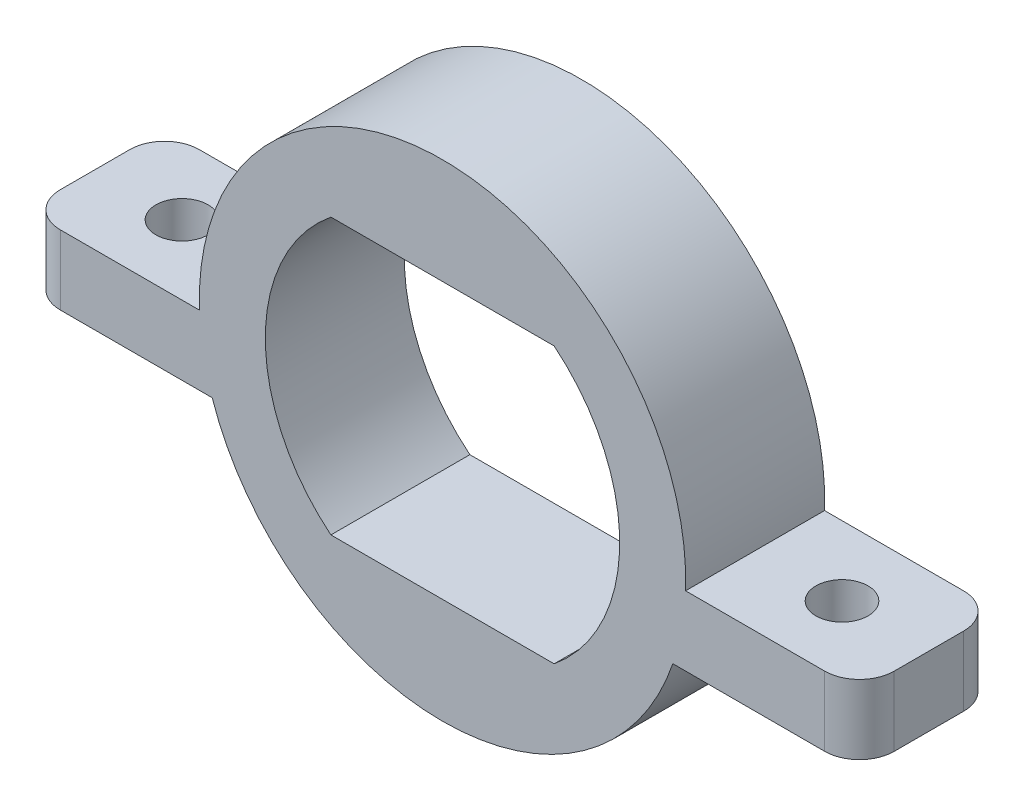
ISO-10303-21;
HEADER;
FILE_DESCRIPTION(('STEP AP214'),'2;1');
FILE_NAME('part.step','',(''),(''),'','','');
FILE_SCHEMA(('AUTOMOTIVE_DESIGN { 1 0 10303 214 1 1 1 1 }'));
ENDSEC;
DATA;
#1=APPLICATION_CONTEXT('core data for automotive mechanical design processes');
#2=APPLICATION_PROTOCOL_DEFINITION('international standard','automotive_design',2000,#1);
#3=PRODUCT_CONTEXT('',#1,'mechanical');
#4=PRODUCT('Part','Part','',(#3));
#5=PRODUCT_RELATED_PRODUCT_CATEGORY('part','',(#4));
#6=PRODUCT_DEFINITION_FORMATION('','',#4);
#7=PRODUCT_DEFINITION_CONTEXT('part definition',#1,'design');
#8=PRODUCT_DEFINITION('design','',#6,#7);
#9=PRODUCT_DEFINITION_SHAPE('','',#8);
#10=(LENGTH_UNIT() NAMED_UNIT(*) SI_UNIT(.MILLI.,.METRE.));
#11=(NAMED_UNIT(*) PLANE_ANGLE_UNIT() SI_UNIT($,.RADIAN.));
#12=(NAMED_UNIT(*) SI_UNIT($,.STERADIAN.) SOLID_ANGLE_UNIT());
#13=UNCERTAINTY_MEASURE_WITH_UNIT(LENGTH_MEASURE(1.E-05),#10,'distance_accuracy_value','');
#14=(GEOMETRIC_REPRESENTATION_CONTEXT(3) GLOBAL_UNCERTAINTY_ASSIGNED_CONTEXT((#13)) GLOBAL_UNIT_ASSIGNED_CONTEXT((#10,
#11,#12)) REPRESENTATION_CONTEXT('',''));
#15=CARTESIAN_POINT('',(0.,0.,0.));
#16=DIRECTION('',(0.,0.,1.));
#17=DIRECTION('',(1.,0.,0.));
#18=AXIS2_PLACEMENT_3D('',#15,#16,#17);
#19=CARTESIAN_POINT('',(24.,-0.5,8.));
#20=DIRECTION('',(0.,-1.,0.));
#21=DIRECTION('',(0.,0.,-1.));
#22=AXIS2_PLACEMENT_3D('',#19,#20,#21);
#23=PLANE('',#22);
#24=CARTESIAN_POINT('',(18.9955342898166,-0.5,4.));
#25=DIRECTION('',(0.,1.,0.));
#26=DIRECTION('',(0.,0.,1.));
#27=AXIS2_PLACEMENT_3D('',#24,#25,#26);
#28=CIRCLE('',#27,1.5);
#29=CARTESIAN_POINT('',(18.9955342898166,-0.5,5.5));
#30=VERTEX_POINT('',#29);
#31=EDGE_CURVE('E177',#30,#30,#28,.T.);
#32=ORIENTED_EDGE('',*,*,#31,.F.);
#33=EDGE_LOOP('',(#32));
#34=FACE_BOUND('',#33,.T.);
#35=DIRECTION('',(-1.,0.,0.));
#36=VECTOR('',#35,1.);
#37=CARTESIAN_POINT('',(24.,-0.5,8.));
#38=LINE('',#37,#36);
#39=CARTESIAN_POINT('',(22.,-0.5,8.));
#40=VERTEX_POINT('',#39);
#41=CARTESIAN_POINT('',(13.9910685796332,-0.500000000000002,8.));
#42=VERTEX_POINT('',#41);
#43=EDGE_CURVE('E194',#40,#42,#38,.T.);
#44=ORIENTED_EDGE('',*,*,#43,.F.);
#45=CARTESIAN_POINT('',(22.,-0.5,6.));
#46=DIRECTION('',(0.,-1.,0.));
#47=DIRECTION('',(0.,0.,-1.));
#48=AXIS2_PLACEMENT_3D('',#45,#46,#47);
#49=CIRCLE('',#48,2.);
#50=CARTESIAN_POINT('',(24.,-0.5,6.));
#51=VERTEX_POINT('',#50);
#52=EDGE_CURVE('E266',#40,#51,#49,.F.);
#53=ORIENTED_EDGE('',*,*,#52,.T.);
#54=DIRECTION('',(0.,0.,-1.));
#55=VECTOR('',#54,1.);
#56=CARTESIAN_POINT('',(24.,-0.5,8.));
#57=LINE('',#56,#55);
#58=CARTESIAN_POINT('',(24.,-0.5,2.));
#59=VERTEX_POINT('',#58);
#60=EDGE_CURVE('E209',#51,#59,#57,.T.);
#61=ORIENTED_EDGE('',*,*,#60,.T.);
#62=CARTESIAN_POINT('',(22.,-0.5,2.));
#63=DIRECTION('',(0.,-1.,0.));
#64=DIRECTION('',(0.,0.,-1.));
#65=AXIS2_PLACEMENT_3D('',#62,#63,#64);
#66=CIRCLE('',#65,2.);
#67=CARTESIAN_POINT('',(22.,-0.5,0.));
#68=VERTEX_POINT('',#67);
#69=EDGE_CURVE('E264',#59,#68,#66,.F.);
#70=ORIENTED_EDGE('',*,*,#69,.T.);
#71=DIRECTION('',(-1.,0.,0.));
#72=VECTOR('',#71,1.);
#73=CARTESIAN_POINT('',(24.,-0.5,0.));
#74=LINE('',#73,#72);
#75=CARTESIAN_POINT('',(13.9910685796332,-0.500000000000002,0.));
#76=VERTEX_POINT('',#75);
#77=EDGE_CURVE('E190',#68,#76,#74,.T.);
#78=ORIENTED_EDGE('',*,*,#77,.T.);
#79=DIRECTION('',(0.,0.,-1.));
#80=VECTOR('',#79,1.);
#81=CARTESIAN_POINT('',(13.9910685796332,-0.500000000000002,8.));
#82=LINE('',#81,#80);
#83=EDGE_CURVE('E241',#42,#76,#82,.T.);
#84=ORIENTED_EDGE('',*,*,#83,.F.);
#85=EDGE_LOOP('',(#44,#53,#61,#70,#78,#84));
#86=FACE_BOUND('',#85,.T.);
#87=ADVANCED_FACE('F33',(#34,#86),#23,.F.);
#88=CARTESIAN_POINT('',(0.,0.,8.));
#89=DIRECTION('',(0.,0.,-1.));
#90=DIRECTION('',(-1.,0.,0.));
#91=AXIS2_PLACEMENT_3D('',#88,#89,#90);
#92=CYLINDRICAL_SURFACE('',#91,14.);
#93=CARTESIAN_POINT('',(0.,0.,0.));
#94=DIRECTION('',(0.,0.,1.));
#95=DIRECTION('',(1.,0.,0.));
#96=AXIS2_PLACEMENT_3D('',#93,#94,#95);
#97=CIRCLE('',#96,14.);
#98=CARTESIAN_POINT('',(-13.9910685796332,-0.499999999999997,0.));
#99=VERTEX_POINT('',#98);
#100=EDGE_CURVE('E211',#76,#99,#97,.T.);
#101=ORIENTED_EDGE('',*,*,#100,.T.);
#102=DIRECTION('',(0.,0.,-1.));
#103=VECTOR('',#102,1.);
#104=CARTESIAN_POINT('',(-13.9910685796332,-0.499999999999997,8.));
#105=LINE('',#104,#103);
#106=CARTESIAN_POINT('',(-13.9910685796332,-0.499999999999997,8.));
#107=VERTEX_POINT('',#106);
#108=EDGE_CURVE('E238',#107,#99,#105,.T.);
#109=ORIENTED_EDGE('',*,*,#108,.F.);
#110=CARTESIAN_POINT('',(0.,0.,8.));
#111=DIRECTION('',(0.,0.,1.));
#112=DIRECTION('',(1.,0.,0.));
#113=AXIS2_PLACEMENT_3D('',#110,#111,#112);
#114=CIRCLE('',#113,14.);
#115=EDGE_CURVE('E196',#42,#107,#114,.T.);
#116=ORIENTED_EDGE('',*,*,#115,.F.);
#117=ORIENTED_EDGE('',*,*,#83,.T.);
#118=EDGE_LOOP('',(#101,#109,#116,#117));
#119=FACE_BOUND('',#118,.T.);
#120=ADVANCED_FACE('F327',(#119),#92,.T.);
#121=CARTESIAN_POINT('',(-24.,-0.5,8.));
#122=DIRECTION('',(0.,1.,0.));
#123=DIRECTION('',(0.,0.,1.));
#124=AXIS2_PLACEMENT_3D('',#121,#122,#123);
#125=PLANE('',#124);
#126=CARTESIAN_POINT('',(-18.9955342898166,-0.5,4.));
#127=DIRECTION('',(0.,1.,0.));
#128=DIRECTION('',(0.,0.,1.));
#129=AXIS2_PLACEMENT_3D('',#126,#127,#128);
#130=CIRCLE('',#129,1.5);
#131=CARTESIAN_POINT('',(-18.9955342898166,-0.5,5.5));
#132=VERTEX_POINT('',#131);
#133=EDGE_CURVE('E250',#132,#132,#130,.T.);
#134=ORIENTED_EDGE('',*,*,#133,.F.);
#135=EDGE_LOOP('',(#134));
#136=FACE_BOUND('',#135,.T.);
#137=DIRECTION('',(1.,0.,0.));
#138=VECTOR('',#137,1.);
#139=CARTESIAN_POINT('',(-24.,-0.5,0.));
#140=LINE('',#139,#138);
#141=CARTESIAN_POINT('',(-22.,-0.5,0.));
#142=VERTEX_POINT('',#141);
#143=EDGE_CURVE('E214',#142,#99,#140,.T.);
#144=ORIENTED_EDGE('',*,*,#143,.F.);
#145=CARTESIAN_POINT('',(-22.,-0.5,2.));
#146=DIRECTION('',(0.,1.,0.));
#147=DIRECTION('',(0.,0.,1.));
#148=AXIS2_PLACEMENT_3D('',#145,#146,#147);
#149=CIRCLE('',#148,2.);
#150=CARTESIAN_POINT('',(-24.,-0.5,2.));
#151=VERTEX_POINT('',#150);
#152=EDGE_CURVE('E11',#142,#151,#149,.T.);
#153=ORIENTED_EDGE('',*,*,#152,.T.);
#154=DIRECTION('',(0.,0.,-1.));
#155=VECTOR('',#154,1.);
#156=CARTESIAN_POINT('',(-24.,-0.5,8.));
#157=LINE('',#156,#155);
#158=CARTESIAN_POINT('',(-24.,-0.5,6.));
#159=VERTEX_POINT('',#158);
#160=EDGE_CURVE('E236',#159,#151,#157,.T.);
#161=ORIENTED_EDGE('',*,*,#160,.F.);
#162=CARTESIAN_POINT('',(-22.,-0.5,6.));
#163=DIRECTION('',(0.,1.,0.));
#164=DIRECTION('',(0.,0.,1.));
#165=AXIS2_PLACEMENT_3D('',#162,#163,#164);
#166=CIRCLE('',#165,2.);
#167=CARTESIAN_POINT('',(-22.,-0.5,8.));
#168=VERTEX_POINT('',#167);
#169=EDGE_CURVE('E41',#159,#168,#166,.T.);
#170=ORIENTED_EDGE('',*,*,#169,.T.);
#171=DIRECTION('',(1.,0.,0.));
#172=VECTOR('',#171,1.);
#173=CARTESIAN_POINT('',(-24.,-0.5,8.));
#174=LINE('',#173,#172);
#175=EDGE_CURVE('E200',#168,#107,#174,.T.);
#176=ORIENTED_EDGE('',*,*,#175,.T.);
#177=ORIENTED_EDGE('',*,*,#108,.T.);
#178=EDGE_LOOP('',(#144,#153,#161,#170,#176,#177));
#179=FACE_BOUND('',#178,.T.);
#180=ADVANCED_FACE('F282',(#136,#179),#125,.T.);
#181=CARTESIAN_POINT('',(-24.,-0.5,8.));
#182=DIRECTION('',(1.,0.,0.));
#183=DIRECTION('',(0.,0.,-1.));
#184=AXIS2_PLACEMENT_3D('',#181,#182,#183);
#185=PLANE('',#184);
#186=ORIENTED_EDGE('',*,*,#160,.T.);
#187=DIRECTION('',(0.,-1.,0.));
#188=VECTOR('',#187,1.);
#189=CARTESIAN_POINT('',(-24.,-0.5,2.));
#190=LINE('',#189,#188);
#191=CARTESIAN_POINT('',(-24.,-4.5,2.));
#192=VERTEX_POINT('',#191);
#193=EDGE_CURVE('E274',#151,#192,#190,.T.);
#194=ORIENTED_EDGE('',*,*,#193,.T.);
#195=DIRECTION('',(0.,0.,-1.));
#196=VECTOR('',#195,1.);
#197=CARTESIAN_POINT('',(-24.,-4.5,8.));
#198=LINE('',#197,#196);
#199=CARTESIAN_POINT('',(-24.,-4.5,6.));
#200=VERTEX_POINT('',#199);
#201=EDGE_CURVE('E233',#200,#192,#198,.T.);
#202=ORIENTED_EDGE('',*,*,#201,.F.);
#203=DIRECTION('',(0.,-1.,0.));
#204=VECTOR('',#203,1.);
#205=CARTESIAN_POINT('',(-24.,-0.5,6.));
#206=LINE('',#205,#204);
#207=EDGE_CURVE('E53',#200,#159,#206,.F.);
#208=ORIENTED_EDGE('',*,*,#207,.T.);
#209=EDGE_LOOP('',(#186,#194,#202,#208));
#210=FACE_BOUND('',#209,.T.);
#211=ADVANCED_FACE('F294',(#210),#185,.F.);
#212=CARTESIAN_POINT('',(-24.,-4.5,8.));
#213=DIRECTION('',(0.,1.,0.));
#214=DIRECTION('',(0.,0.,1.));
#215=AXIS2_PLACEMENT_3D('',#212,#213,#214);
#216=PLANE('',#215);
#217=CARTESIAN_POINT('',(-18.9955342898166,-4.5,4.));
#218=DIRECTION('',(0.,1.,0.));
#219=DIRECTION('',(0.,0.,1.));
#220=AXIS2_PLACEMENT_3D('',#217,#218,#219);
#221=CIRCLE('',#220,1.5);
#222=CARTESIAN_POINT('',(-18.9955342898166,-4.5,5.5));
#223=VERTEX_POINT('',#222);
#224=EDGE_CURVE('E247',#223,#223,#221,.T.);
#225=ORIENTED_EDGE('',*,*,#224,.T.);
#226=EDGE_LOOP('',(#225));
#227=FACE_BOUND('',#226,.T.);
#228=ORIENTED_EDGE('',*,*,#201,.T.);
#229=CARTESIAN_POINT('',(-22.,-4.5,2.));
#230=DIRECTION('',(0.,1.,0.));
#231=DIRECTION('',(0.,0.,1.));
#232=AXIS2_PLACEMENT_3D('',#229,#230,#231);
#233=CIRCLE('',#232,2.);
#234=CARTESIAN_POINT('',(-22.,-4.5,0.));
#235=VERTEX_POINT('',#234);
#236=EDGE_CURVE('E279',#192,#235,#233,.F.);
#237=ORIENTED_EDGE('',*,*,#236,.T.);
#238=DIRECTION('',(1.,0.,0.));
#239=VECTOR('',#238,1.);
#240=CARTESIAN_POINT('',(-24.,-4.5,0.));
#241=LINE('',#240,#239);
#242=CARTESIAN_POINT('',(-13.2570735835629,-4.5,0.));
#243=VERTEX_POINT('',#242);
#244=EDGE_CURVE('E216',#235,#243,#241,.T.);
#245=ORIENTED_EDGE('',*,*,#244,.T.);
#246=DIRECTION('',(0.,0.,-1.));
#247=VECTOR('',#246,1.);
#248=CARTESIAN_POINT('',(-13.2570735835629,-4.5,8.));
#249=LINE('',#248,#247);
#250=CARTESIAN_POINT('',(-13.2570735835629,-4.5,8.));
#251=VERTEX_POINT('',#250);
#252=EDGE_CURVE('E230',#251,#243,#249,.T.);
#253=ORIENTED_EDGE('',*,*,#252,.F.);
#254=DIRECTION('',(1.,0.,0.));
#255=VECTOR('',#254,1.);
#256=CARTESIAN_POINT('',(-24.,-4.5,8.));
#257=LINE('',#256,#255);
#258=CARTESIAN_POINT('',(-22.,-4.5,8.));
#259=VERTEX_POINT('',#258);
#260=EDGE_CURVE('E202',#259,#251,#257,.T.);
#261=ORIENTED_EDGE('',*,*,#260,.F.);
#262=CARTESIAN_POINT('',(-22.,-4.5,6.));
#263=DIRECTION('',(0.,1.,0.));
#264=DIRECTION('',(0.,0.,1.));
#265=AXIS2_PLACEMENT_3D('',#262,#263,#264);
#266=CIRCLE('',#265,2.);
#267=EDGE_CURVE('E277',#259,#200,#266,.F.);
#268=ORIENTED_EDGE('',*,*,#267,.T.);
#269=EDGE_LOOP('',(#228,#237,#245,#253,#261,#268));
#270=FACE_BOUND('',#269,.T.);
#271=ADVANCED_FACE('F292',(#227,#270),#216,.F.);
#272=CARTESIAN_POINT('',(0.,0.,8.));
#273=DIRECTION('',(0.,0.,-1.));
#274=DIRECTION('',(-1.,0.,0.));
#275=AXIS2_PLACEMENT_3D('',#272,#273,#274);
#276=CYLINDRICAL_SURFACE('',#275,14.);
#277=CARTESIAN_POINT('',(0.,0.,0.));
#278=DIRECTION('',(0.,0.,1.));
#279=DIRECTION('',(1.,0.,0.));
#280=AXIS2_PLACEMENT_3D('',#277,#278,#279);
#281=CIRCLE('',#280,14.);
#282=CARTESIAN_POINT('',(13.2570735835628,-4.50000000000001,0.));
#283=VERTEX_POINT('',#282);
#284=EDGE_CURVE('E218',#243,#283,#281,.T.);
#285=ORIENTED_EDGE('',*,*,#284,.T.);
#286=DIRECTION('',(0.,0.,-1.));
#287=VECTOR('',#286,1.);
#288=CARTESIAN_POINT('',(13.2570735835628,-4.50000000000001,8.));
#289=LINE('',#288,#287);
#290=CARTESIAN_POINT('',(13.2570735835628,-4.50000000000001,8.));
#291=VERTEX_POINT('',#290);
#292=EDGE_CURVE('E227',#291,#283,#289,.T.);
#293=ORIENTED_EDGE('',*,*,#292,.F.);
#294=CARTESIAN_POINT('',(0.,0.,8.));
#295=DIRECTION('',(0.,0.,1.));
#296=DIRECTION('',(1.,0.,0.));
#297=AXIS2_PLACEMENT_3D('',#294,#295,#296);
#298=CIRCLE('',#297,14.);
#299=EDGE_CURVE('E204',#251,#291,#298,.T.);
#300=ORIENTED_EDGE('',*,*,#299,.F.);
#301=ORIENTED_EDGE('',*,*,#252,.T.);
#302=EDGE_LOOP('',(#285,#293,#300,#301));
#303=FACE_BOUND('',#302,.T.);
#304=ADVANCED_FACE('F305',(#303),#276,.T.);
#305=CARTESIAN_POINT('',(24.,-4.5,8.));
#306=DIRECTION('',(0.,-1.,0.));
#307=DIRECTION('',(0.,0.,-1.));
#308=AXIS2_PLACEMENT_3D('',#305,#306,#307);
#309=PLANE('',#308);
#310=CARTESIAN_POINT('',(18.9955342898166,-4.5,4.));
#311=DIRECTION('',(0.,-1.,0.));
#312=DIRECTION('',(0.,0.,-1.));
#313=AXIS2_PLACEMENT_3D('',#310,#311,#312);
#314=CIRCLE('',#313,1.5);
#315=CARTESIAN_POINT('',(18.9955342898166,-4.5,2.5));
#316=VERTEX_POINT('',#315);
#317=EDGE_CURVE('E184',#316,#316,#314,.T.);
#318=ORIENTED_EDGE('',*,*,#317,.F.);
#319=EDGE_LOOP('',(#318));
#320=FACE_BOUND('',#319,.T.);
#321=DIRECTION('',(0.,0.,-1.));
#322=VECTOR('',#321,1.);
#323=CARTESIAN_POINT('',(24.,-4.5,8.));
#324=LINE('',#323,#322);
#325=CARTESIAN_POINT('',(24.,-4.5,6.));
#326=VERTEX_POINT('',#325);
#327=CARTESIAN_POINT('',(24.,-4.5,2.));
#328=VERTEX_POINT('',#327);
#329=EDGE_CURVE('E224',#326,#328,#324,.T.);
#330=ORIENTED_EDGE('',*,*,#329,.F.);
#331=CARTESIAN_POINT('',(22.,-4.5,6.));
#332=DIRECTION('',(0.,-1.,0.));
#333=DIRECTION('',(0.,0.,-1.));
#334=AXIS2_PLACEMENT_3D('',#331,#332,#333);
#335=CIRCLE('',#334,2.);
#336=CARTESIAN_POINT('',(22.,-4.5,8.));
#337=VERTEX_POINT('',#336);
#338=EDGE_CURVE('E257',#326,#337,#335,.T.);
#339=ORIENTED_EDGE('',*,*,#338,.T.);
#340=DIRECTION('',(-1.,0.,0.));
#341=VECTOR('',#340,1.);
#342=CARTESIAN_POINT('',(24.,-4.5,8.));
#343=LINE('',#342,#341);
#344=EDGE_CURVE('E207',#337,#291,#343,.T.);
#345=ORIENTED_EDGE('',*,*,#344,.T.);
#346=ORIENTED_EDGE('',*,*,#292,.T.);
#347=DIRECTION('',(-1.,0.,0.));
#348=VECTOR('',#347,1.);
#349=CARTESIAN_POINT('',(24.,-4.5,0.));
#350=LINE('',#349,#348);
#351=CARTESIAN_POINT('',(22.,-4.5,0.));
#352=VERTEX_POINT('',#351);
#353=EDGE_CURVE('E197',#352,#283,#350,.T.);
#354=ORIENTED_EDGE('',*,*,#353,.F.);
#355=CARTESIAN_POINT('',(22.,-4.5,2.));
#356=DIRECTION('',(0.,-1.,0.));
#357=DIRECTION('',(0.,0.,-1.));
#358=AXIS2_PLACEMENT_3D('',#355,#356,#357);
#359=CIRCLE('',#358,2.);
#360=EDGE_CURVE('E255',#352,#328,#359,.T.);
#361=ORIENTED_EDGE('',*,*,#360,.T.);
#362=EDGE_LOOP('',(#330,#339,#345,#346,#354,#361));
#363=FACE_BOUND('',#362,.T.);
#364=ADVANCED_FACE('F396',(#320,#363),#309,.T.);
#365=CARTESIAN_POINT('',(24.,-0.5,8.));
#366=DIRECTION('',(1.,0.,0.));
#367=DIRECTION('',(0.,0.,-1.));
#368=AXIS2_PLACEMENT_3D('',#365,#366,#367);
#369=PLANE('',#368);
#370=ORIENTED_EDGE('',*,*,#60,.F.);
#371=DIRECTION('',(0.,-1.,0.));
#372=VECTOR('',#371,1.);
#373=CARTESIAN_POINT('',(24.,-0.5,6.));
#374=LINE('',#373,#372);
#375=EDGE_CURVE('E252',#51,#326,#374,.T.);
#376=ORIENTED_EDGE('',*,*,#375,.T.);
#377=ORIENTED_EDGE('',*,*,#329,.T.);
#378=DIRECTION('',(0.,-1.,0.));
#379=VECTOR('',#378,1.);
#380=CARTESIAN_POINT('',(24.,-0.5,2.));
#381=LINE('',#380,#379);
#382=EDGE_CURVE('E244',#328,#59,#381,.F.);
#383=ORIENTED_EDGE('',*,*,#382,.T.);
#384=EDGE_LOOP('',(#370,#376,#377,#383));
#385=FACE_BOUND('',#384,.T.);
#386=ADVANCED_FACE('F319',(#385),#369,.T.);
#387=CARTESIAN_POINT('',(0.,0.,8.));
#388=DIRECTION('',(0.,0.,1.));
#389=DIRECTION('',(1.,0.,0.));
#390=AXIS2_PLACEMENT_3D('',#387,#388,#389);
#391=PLANE('',#390);
#392=CARTESIAN_POINT('',(0.,0.,8.));
#393=DIRECTION('',(0.,0.,1.));
#394=DIRECTION('',(1.,0.,0.));
#395=AXIS2_PLACEMENT_3D('',#392,#393,#394);
#396=CIRCLE('',#395,10.2);
#397=CARTESIAN_POINT('',(-6.425,7.92208148152996,8.));
#398=VERTEX_POINT('',#397);
#399=CARTESIAN_POINT('',(-6.425,-7.92208148152996,8.));
#400=VERTEX_POINT('',#399);
#401=EDGE_CURVE('E153',#398,#400,#396,.T.);
#402=ORIENTED_EDGE('',*,*,#401,.F.);
#403=DIRECTION('',(-1.,0.,0.));
#404=VECTOR('',#403,1.);
#405=CARTESIAN_POINT('',(-6.425,7.92208148152996,8.));
#406=LINE('',#405,#404);
#407=CARTESIAN_POINT('',(6.425,7.92208148152996,8.));
#408=VERTEX_POINT('',#407);
#409=EDGE_CURVE('E171',#408,#398,#406,.T.);
#410=ORIENTED_EDGE('',*,*,#409,.F.);
#411=CARTESIAN_POINT('',(0.,0.,8.));
#412=DIRECTION('',(0.,0.,1.));
#413=DIRECTION('',(-1.,0.,0.));
#414=AXIS2_PLACEMENT_3D('',#411,#412,#413);
#415=CIRCLE('',#414,10.2);
#416=CARTESIAN_POINT('',(6.425,-7.92208148152996,8.));
#417=VERTEX_POINT('',#416);
#418=EDGE_CURVE('E174',#417,#408,#415,.T.);
#419=ORIENTED_EDGE('',*,*,#418,.F.);
#420=DIRECTION('',(1.,0.,0.));
#421=VECTOR('',#420,1.);
#422=CARTESIAN_POINT('',(-6.425,-7.92208148152996,8.));
#423=LINE('',#422,#421);
#424=EDGE_CURVE('E183',#400,#417,#423,.T.);
#425=ORIENTED_EDGE('',*,*,#424,.F.);
#426=EDGE_LOOP('',(#402,#410,#419,#425));
#427=FACE_BOUND('',#426,.T.);
#428=ORIENTED_EDGE('',*,*,#344,.F.);
#429=DIRECTION('',(0.,-1.,0.));
#430=VECTOR('',#429,1.);
#431=CARTESIAN_POINT('',(22.,0.,8.));
#432=LINE('',#431,#430);
#433=EDGE_CURVE('E262',#337,#40,#432,.F.);
#434=ORIENTED_EDGE('',*,*,#433,.T.);
#435=ORIENTED_EDGE('',*,*,#43,.T.);
#436=ORIENTED_EDGE('',*,*,#115,.T.);
#437=ORIENTED_EDGE('',*,*,#175,.F.);
#438=DIRECTION('',(0.,-1.,0.));
#439=VECTOR('',#438,1.);
#440=CARTESIAN_POINT('',(-22.,-4.5,8.));
#441=LINE('',#440,#439);
#442=EDGE_CURVE('E259',#168,#259,#441,.T.);
#443=ORIENTED_EDGE('',*,*,#442,.T.);
#444=ORIENTED_EDGE('',*,*,#260,.T.);
#445=ORIENTED_EDGE('',*,*,#299,.T.);
#446=EDGE_LOOP('',(#428,#434,#435,#436,#437,#443,#444,#445));
#447=FACE_BOUND('',#446,.T.);
#448=ADVANCED_FACE('F287',(#427,#447),#391,.T.);
#449=CARTESIAN_POINT('',(0.,0.,0.));
#450=DIRECTION('',(0.,0.,1.));
#451=DIRECTION('',(1.,0.,0.));
#452=AXIS2_PLACEMENT_3D('',#449,#450,#451);
#453=PLANE('',#452);
#454=DIRECTION('',(-1.,0.,0.));
#455=VECTOR('',#454,1.);
#456=CARTESIAN_POINT('',(-6.425,7.92208148152996,0.));
#457=LINE('',#456,#455);
#458=CARTESIAN_POINT('',(6.425,7.92208148152996,0.));
#459=VERTEX_POINT('',#458);
#460=CARTESIAN_POINT('',(-6.425,7.92208148152996,0.));
#461=VERTEX_POINT('',#460);
#462=EDGE_CURVE('E158',#459,#461,#457,.T.);
#463=ORIENTED_EDGE('',*,*,#462,.T.);
#464=CARTESIAN_POINT('',(0.,0.,0.));
#465=DIRECTION('',(0.,0.,1.));
#466=DIRECTION('',(1.,0.,0.));
#467=AXIS2_PLACEMENT_3D('',#464,#465,#466);
#468=CIRCLE('',#467,10.2);
#469=CARTESIAN_POINT('',(-6.425,-7.92208148152996,0.));
#470=VERTEX_POINT('',#469);
#471=EDGE_CURVE('E150',#461,#470,#468,.T.);
#472=ORIENTED_EDGE('',*,*,#471,.T.);
#473=DIRECTION('',(1.,0.,0.));
#474=VECTOR('',#473,1.);
#475=CARTESIAN_POINT('',(-6.425,-7.92208148152996,0.));
#476=LINE('',#475,#474);
#477=CARTESIAN_POINT('',(6.425,-7.92208148152996,0.));
#478=VERTEX_POINT('',#477);
#479=EDGE_CURVE('E162',#470,#478,#476,.T.);
#480=ORIENTED_EDGE('',*,*,#479,.T.);
#481=CARTESIAN_POINT('',(0.,0.,0.));
#482=DIRECTION('',(0.,0.,1.));
#483=DIRECTION('',(-1.,0.,0.));
#484=AXIS2_PLACEMENT_3D('',#481,#482,#483);
#485=CIRCLE('',#484,10.2);
#486=EDGE_CURVE('E166',#478,#459,#485,.T.);
#487=ORIENTED_EDGE('',*,*,#486,.T.);
#488=EDGE_LOOP('',(#463,#472,#480,#487));
#489=FACE_BOUND('',#488,.T.);
#490=ORIENTED_EDGE('',*,*,#77,.F.);
#491=DIRECTION('',(0.,-1.,0.));
#492=VECTOR('',#491,1.);
#493=CARTESIAN_POINT('',(22.,-4.5,0.));
#494=LINE('',#493,#492);
#495=EDGE_CURVE('E270',#68,#352,#494,.T.);
#496=ORIENTED_EDGE('',*,*,#495,.T.);
#497=ORIENTED_EDGE('',*,*,#353,.T.);
#498=ORIENTED_EDGE('',*,*,#284,.F.);
#499=ORIENTED_EDGE('',*,*,#244,.F.);
#500=DIRECTION('',(0.,-1.,0.));
#501=VECTOR('',#500,1.);
#502=CARTESIAN_POINT('',(-22.,0.,0.));
#503=LINE('',#502,#501);
#504=EDGE_CURVE('E268',#235,#142,#503,.F.);
#505=ORIENTED_EDGE('',*,*,#504,.T.);
#506=ORIENTED_EDGE('',*,*,#143,.T.);
#507=ORIENTED_EDGE('',*,*,#100,.F.);
#508=EDGE_LOOP('',(#490,#496,#497,#498,#499,#505,#506,#507));
#509=FACE_BOUND('',#508,.T.);
#510=ADVANCED_FACE('F168',(#489,#509),#453,.F.);
#511=CARTESIAN_POINT('',(0.,0.,0.));
#512=DIRECTION('',(0.,0.,1.));
#513=DIRECTION('',(1.,0.,0.));
#514=AXIS2_PLACEMENT_3D('',#511,#512,#513);
#515=CYLINDRICAL_SURFACE('',#514,10.2);
#516=ORIENTED_EDGE('',*,*,#401,.T.);
#517=DIRECTION('',(0.,0.,1.));
#518=VECTOR('',#517,1.);
#519=CARTESIAN_POINT('',(-6.425,-7.92208148152996,0.));
#520=LINE('',#519,#518);
#521=EDGE_CURVE('E146',#470,#400,#520,.T.);
#522=ORIENTED_EDGE('',*,*,#521,.F.);
#523=ORIENTED_EDGE('',*,*,#471,.F.);
#524=DIRECTION('',(0.,0.,1.));
#525=VECTOR('',#524,1.);
#526=CARTESIAN_POINT('',(-6.425,7.92208148152996,0.));
#527=LINE('',#526,#525);
#528=EDGE_CURVE('E188',#461,#398,#527,.T.);
#529=ORIENTED_EDGE('',*,*,#528,.T.);
#530=EDGE_LOOP('',(#516,#522,#523,#529));
#531=FACE_BOUND('',#530,.T.);
#532=ADVANCED_FACE('F148',(#531),#515,.F.);
#533=CARTESIAN_POINT('',(-6.425,7.92208148152996,0.));
#534=DIRECTION('',(0.,1.,0.));
#535=DIRECTION('',(0.,0.,1.));
#536=AXIS2_PLACEMENT_3D('',#533,#534,#535);
#537=PLANE('',#536);
#538=ORIENTED_EDGE('',*,*,#409,.T.);
#539=ORIENTED_EDGE('',*,*,#528,.F.);
#540=ORIENTED_EDGE('',*,*,#462,.F.);
#541=DIRECTION('',(0.,0.,1.));
#542=VECTOR('',#541,1.);
#543=CARTESIAN_POINT('',(6.425,7.92208148152996,0.));
#544=LINE('',#543,#542);
#545=EDGE_CURVE('E191',#459,#408,#544,.T.);
#546=ORIENTED_EDGE('',*,*,#545,.T.);
#547=EDGE_LOOP('',(#538,#539,#540,#546));
#548=FACE_BOUND('',#547,.T.);
#549=ADVANCED_FACE('F471',(#548),#537,.F.);
#550=CARTESIAN_POINT('',(0.,0.,0.));
#551=DIRECTION('',(0.,0.,1.));
#552=DIRECTION('',(1.,0.,0.));
#553=AXIS2_PLACEMENT_3D('',#550,#551,#552);
#554=CYLINDRICAL_SURFACE('',#553,10.2);
#555=ORIENTED_EDGE('',*,*,#418,.T.);
#556=ORIENTED_EDGE('',*,*,#545,.F.);
#557=ORIENTED_EDGE('',*,*,#486,.F.);
#558=DIRECTION('',(0.,0.,1.));
#559=VECTOR('',#558,1.);
#560=CARTESIAN_POINT('',(6.425,-7.92208148152996,0.));
#561=LINE('',#560,#559);
#562=EDGE_CURVE('E157',#478,#417,#561,.T.);
#563=ORIENTED_EDGE('',*,*,#562,.T.);
#564=EDGE_LOOP('',(#555,#556,#557,#563));
#565=FACE_BOUND('',#564,.T.);
#566=ADVANCED_FACE('F462',(#565),#554,.F.);
#567=CARTESIAN_POINT('',(-6.425,-7.92208148152996,0.));
#568=DIRECTION('',(0.,-1.,0.));
#569=DIRECTION('',(1.,0.,0.));
#570=AXIS2_PLACEMENT_3D('',#567,#568,#569);
#571=PLANE('',#570);
#572=ORIENTED_EDGE('',*,*,#424,.T.);
#573=ORIENTED_EDGE('',*,*,#562,.F.);
#574=ORIENTED_EDGE('',*,*,#479,.F.);
#575=ORIENTED_EDGE('',*,*,#521,.T.);
#576=EDGE_LOOP('',(#572,#573,#574,#575));
#577=FACE_BOUND('',#576,.T.);
#578=ADVANCED_FACE('F163',(#577),#571,.F.);
#579=CARTESIAN_POINT('',(18.9955342898166,-5.5,4.));
#580=DIRECTION('',(0.,1.,0.));
#581=DIRECTION('',(0.,0.,1.));
#582=AXIS2_PLACEMENT_3D('',#579,#580,#581);
#583=CYLINDRICAL_SURFACE('',#582,1.5);
#584=ORIENTED_EDGE('',*,*,#317,.T.);
#585=EDGE_LOOP('',(#584));
#586=FACE_BOUND('',#585,.T.);
#587=ORIENTED_EDGE('',*,*,#31,.T.);
#588=EDGE_LOOP('',(#587));
#589=FACE_BOUND('',#588,.T.);
#590=ADVANCED_FACE('F443',(#586,#589),#583,.F.);
#591=CARTESIAN_POINT('',(-18.9955342898166,-5.5,4.));
#592=DIRECTION('',(0.,1.,0.));
#593=DIRECTION('',(0.,0.,1.));
#594=AXIS2_PLACEMENT_3D('',#591,#592,#593);
#595=CYLINDRICAL_SURFACE('',#594,1.5);
#596=ORIENTED_EDGE('',*,*,#133,.T.);
#597=EDGE_LOOP('',(#596));
#598=FACE_BOUND('',#597,.T.);
#599=ORIENTED_EDGE('',*,*,#224,.F.);
#600=EDGE_LOOP('',(#599));
#601=FACE_BOUND('',#600,.T.);
#602=ADVANCED_FACE('F342',(#598,#601),#595,.F.);
#603=CARTESIAN_POINT('',(22.,-0.5,6.));
#604=DIRECTION('',(0.,-1.,0.));
#605=DIRECTION('',(0.,0.,-1.));
#606=AXIS2_PLACEMENT_3D('',#603,#604,#605);
#607=CYLINDRICAL_SURFACE('',#606,2.);
#608=ORIENTED_EDGE('',*,*,#52,.F.);
#609=ORIENTED_EDGE('',*,*,#433,.F.);
#610=ORIENTED_EDGE('',*,*,#338,.F.);
#611=ORIENTED_EDGE('',*,*,#375,.F.);
#612=EDGE_LOOP('',(#608,#609,#610,#611));
#613=FACE_BOUND('',#612,.T.);
#614=ADVANCED_FACE('F312',(#613),#607,.T.);
#615=CARTESIAN_POINT('',(22.,0.,2.));
#616=DIRECTION('',(0.,1.,0.));
#617=DIRECTION('',(0.,0.,1.));
#618=AXIS2_PLACEMENT_3D('',#615,#616,#617);
#619=CYLINDRICAL_SURFACE('',#618,2.);
#620=ORIENTED_EDGE('',*,*,#69,.F.);
#621=ORIENTED_EDGE('',*,*,#382,.F.);
#622=ORIENTED_EDGE('',*,*,#360,.F.);
#623=ORIENTED_EDGE('',*,*,#495,.F.);
#624=EDGE_LOOP('',(#620,#621,#622,#623));
#625=FACE_BOUND('',#624,.T.);
#626=ADVANCED_FACE('F323',(#625),#619,.T.);
#627=CARTESIAN_POINT('',(-22.,-0.5,2.));
#628=DIRECTION('',(0.,-1.,0.));
#629=DIRECTION('',(0.,0.,-1.));
#630=AXIS2_PLACEMENT_3D('',#627,#628,#629);
#631=CYLINDRICAL_SURFACE('',#630,2.);
#632=ORIENTED_EDGE('',*,*,#152,.F.);
#633=ORIENTED_EDGE('',*,*,#504,.F.);
#634=ORIENTED_EDGE('',*,*,#236,.F.);
#635=ORIENTED_EDGE('',*,*,#193,.F.);
#636=EDGE_LOOP('',(#632,#633,#634,#635));
#637=FACE_BOUND('',#636,.T.);
#638=ADVANCED_FACE('F297',(#637),#631,.T.);
#639=CARTESIAN_POINT('',(-22.,0.,6.));
#640=DIRECTION('',(0.,1.,0.));
#641=DIRECTION('',(0.,0.,1.));
#642=AXIS2_PLACEMENT_3D('',#639,#640,#641);
#643=CYLINDRICAL_SURFACE('',#642,2.);
#644=ORIENTED_EDGE('',*,*,#169,.F.);
#645=ORIENTED_EDGE('',*,*,#207,.F.);
#646=ORIENTED_EDGE('',*,*,#267,.F.);
#647=ORIENTED_EDGE('',*,*,#442,.F.);
#648=EDGE_LOOP('',(#644,#645,#646,#647));
#649=FACE_BOUND('',#648,.T.);
#650=ADVANCED_FACE('F35',(#649),#643,.T.);
#651=CLOSED_SHELL('',(#87,#120,#180,#211,#271,#304,#364,#386,#448,#510,#532,#549,#566,#578,#590,
#602,#614,#626,#638,#650));
#652=MANIFOLD_SOLID_BREP('B2',#651);
#653=ADVANCED_BREP_SHAPE_REPRESENTATION('',(#18,#652),#14);
#654=SHAPE_DEFINITION_REPRESENTATION(#9,#653);
ENDSEC;
END-ISO-10303-21;
